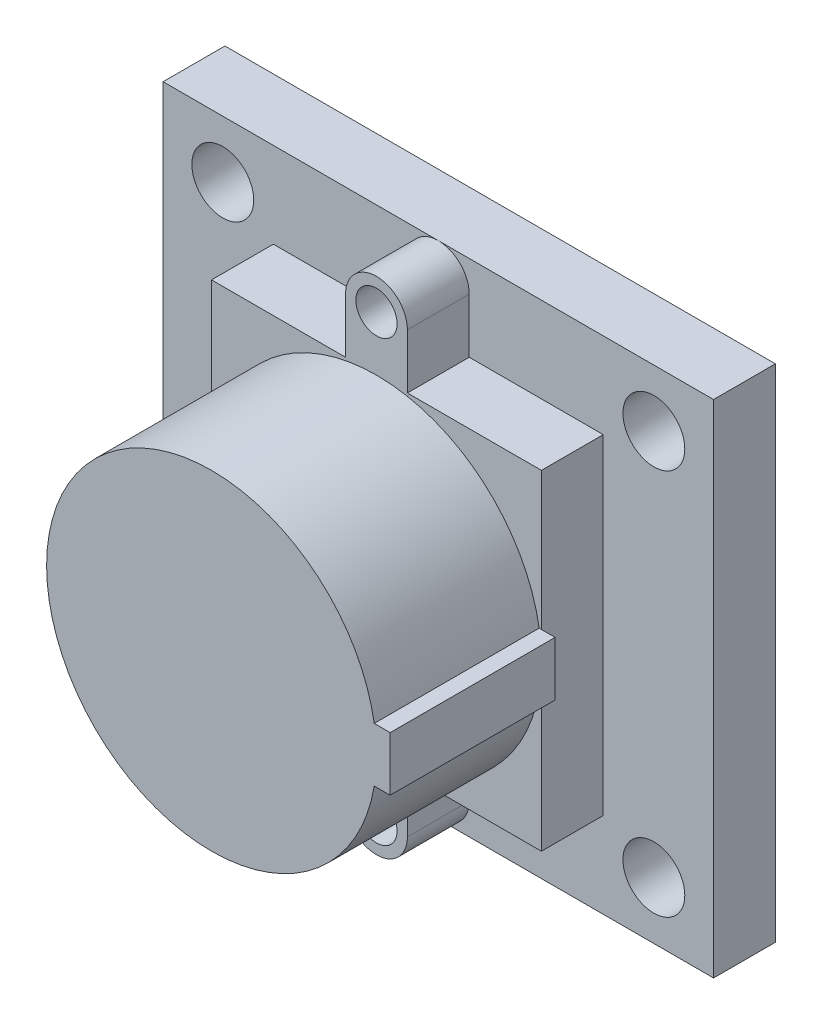
ISO-10303-21;
HEADER;
FILE_DESCRIPTION(('STEP AP214'),'2;1');
FILE_NAME('part.step','',(''),(''),'','','');
FILE_SCHEMA(('AUTOMOTIVE_DESIGN { 1 0 10303 214 1 1 1 1 }'));
ENDSEC;
DATA;
#1=APPLICATION_CONTEXT('core data for automotive mechanical design processes');
#2=APPLICATION_PROTOCOL_DEFINITION('international standard','automotive_design',2000,#1);
#3=PRODUCT_CONTEXT('',#1,'mechanical');
#4=PRODUCT('Part','Part','',(#3));
#5=PRODUCT_RELATED_PRODUCT_CATEGORY('part','',(#4));
#6=PRODUCT_DEFINITION_FORMATION('','',#4);
#7=PRODUCT_DEFINITION_CONTEXT('part definition',#1,'design');
#8=PRODUCT_DEFINITION('design','',#6,#7);
#9=PRODUCT_DEFINITION_SHAPE('','',#8);
#10=(LENGTH_UNIT() NAMED_UNIT(*) SI_UNIT(.MILLI.,.METRE.));
#11=(NAMED_UNIT(*) PLANE_ANGLE_UNIT() SI_UNIT($,.RADIAN.));
#12=(NAMED_UNIT(*) SI_UNIT($,.STERADIAN.) SOLID_ANGLE_UNIT());
#13=UNCERTAINTY_MEASURE_WITH_UNIT(LENGTH_MEASURE(1.E-05),#10,'distance_accuracy_value','');
#14=(GEOMETRIC_REPRESENTATION_CONTEXT(3) GLOBAL_UNCERTAINTY_ASSIGNED_CONTEXT((#13)) GLOBAL_UNIT_ASSIGNED_CONTEXT((#10,
#11,#12)) REPRESENTATION_CONTEXT('',''));
#15=CARTESIAN_POINT('',(0.,0.,0.));
#16=DIRECTION('',(0.,0.,1.));
#17=DIRECTION('',(1.,0.,0.));
#18=AXIS2_PLACEMENT_3D('',#15,#16,#17);
#19=CARTESIAN_POINT('',(20.0444022965701,10.65,6.));
#20=DIRECTION('',(0.,0.,1.));
#21=DIRECTION('',(1.,0.,0.));
#22=AXIS2_PLACEMENT_3D('',#19,#20,#21);
#23=PLANE('',#22);
#24=DIRECTION('',(1.,0.,0.));
#25=VECTOR('',#24,1.);
#26=CARTESIAN_POINT('',(27.9355322487527,-1.31532052282532,6.));
#27=LINE('',#26,#25);
#28=CARTESIAN_POINT('',(27.9355322487527,-1.31532052282532,6.));
#29=VERTEX_POINT('',#28);
#30=CARTESIAN_POINT('',(28.0444022965701,-1.31532052282533,6.));
#31=VERTEX_POINT('',#30);
#32=EDGE_CURVE('E59',#29,#31,#27,.T.);
#33=ORIENTED_EDGE('',*,*,#32,.F.);
#34=CARTESIAN_POINT('',(20.0444022965701,0.,6.));
#35=DIRECTION('',(0.,0.,1.));
#36=DIRECTION('',(1.,0.,0.));
#37=AXIS2_PLACEMENT_3D('',#34,#35,#36);
#38=CIRCLE('',#37,8.);
#39=CARTESIAN_POINT('',(12.0444022965701,0.,6.));
#40=VERTEX_POINT('',#39);
#41=EDGE_CURVE('E11',#40,#29,#38,.T.);
#42=ORIENTED_EDGE('',*,*,#41,.F.);
#43=DIRECTION('',(0.,-1.,0.));
#44=VECTOR('',#43,1.);
#45=CARTESIAN_POINT('',(12.0444022965701,8.,6.));
#46=LINE('',#45,#44);
#47=CARTESIAN_POINT('',(12.0444022965701,-8.,6.));
#48=VERTEX_POINT('',#47);
#49=EDGE_CURVE('E255',#40,#48,#46,.T.);
#50=ORIENTED_EDGE('',*,*,#49,.T.);
#51=DIRECTION('',(1.,0.,0.));
#52=VECTOR('',#51,1.);
#53=CARTESIAN_POINT('',(12.0444022965701,-8.,6.));
#54=LINE('',#53,#52);
#55=CARTESIAN_POINT('',(18.5444022965701,-8.,6.));
#56=VERTEX_POINT('',#55);
#57=EDGE_CURVE('E259',#48,#56,#54,.T.);
#58=ORIENTED_EDGE('',*,*,#57,.T.);
#59=DIRECTION('',(0.,-1.,0.));
#60=VECTOR('',#59,1.);
#61=CARTESIAN_POINT('',(18.5444022965701,-10.65,6.));
#62=LINE('',#61,#60);
#63=CARTESIAN_POINT('',(18.5444022965701,-10.65,6.));
#64=VERTEX_POINT('',#63);
#65=EDGE_CURVE('E261',#56,#64,#62,.T.);
#66=ORIENTED_EDGE('',*,*,#65,.T.);
#67=CARTESIAN_POINT('',(20.0444022965701,-10.65,6.));
#68=DIRECTION('',(0.,0.,1.));
#69=DIRECTION('',(1.,0.,0.));
#70=AXIS2_PLACEMENT_3D('',#67,#68,#69);
#71=CIRCLE('',#70,1.5);
#72=CARTESIAN_POINT('',(21.5444022965701,-10.65,6.));
#73=VERTEX_POINT('',#72);
#74=EDGE_CURVE('E263',#64,#73,#71,.T.);
#75=ORIENTED_EDGE('',*,*,#74,.T.);
#76=DIRECTION('',(0.,1.,0.));
#77=VECTOR('',#76,1.);
#78=CARTESIAN_POINT('',(21.5444022965701,-10.65,6.));
#79=LINE('',#78,#77);
#80=CARTESIAN_POINT('',(21.5444022965701,-8.,6.));
#81=VERTEX_POINT('',#80);
#82=EDGE_CURVE('E265',#73,#81,#79,.T.);
#83=ORIENTED_EDGE('',*,*,#82,.T.);
#84=DIRECTION('',(1.,0.,0.));
#85=VECTOR('',#84,1.);
#86=CARTESIAN_POINT('',(21.5444022965701,-8.,6.));
#87=LINE('',#86,#85);
#88=CARTESIAN_POINT('',(28.0444022965701,-8.,6.));
#89=VERTEX_POINT('',#88);
#90=EDGE_CURVE('E237',#81,#89,#87,.T.);
#91=ORIENTED_EDGE('',*,*,#90,.T.);
#92=DIRECTION('',(0.,1.,0.));
#93=VECTOR('',#92,1.);
#94=CARTESIAN_POINT('',(28.0444022965701,-1.75,6.));
#95=LINE('',#94,#93);
#96=EDGE_CURVE('E242',#89,#31,#95,.T.);
#97=ORIENTED_EDGE('',*,*,#96,.T.);
#98=EDGE_LOOP('',(#33,#42,#50,#58,#66,#75,#83,#91,#97));
#99=FACE_BOUND('',#98,.T.);
#100=CARTESIAN_POINT('',(20.0444022965701,-10.65,6.));
#101=DIRECTION('',(0.,0.,1.));
#102=DIRECTION('',(1.,0.,0.));
#103=AXIS2_PLACEMENT_3D('',#100,#101,#102);
#104=CIRCLE('',#103,1.);
#105=CARTESIAN_POINT('',(21.0444022965701,-10.65,6.));
#106=VERTEX_POINT('',#105);
#107=EDGE_CURVE('E222',#106,#106,#104,.T.);
#108=ORIENTED_EDGE('',*,*,#107,.F.);
#109=EDGE_LOOP('',(#108));
#110=FACE_BOUND('',#109,.T.);
#111=ADVANCED_FACE('F41',(#99,#110),#23,.T.);
#112=CARTESIAN_POINT('',(0.,0.,3.));
#113=DIRECTION('',(0.,0.,1.));
#114=DIRECTION('',(1.,0.,0.));
#115=AXIS2_PLACEMENT_3D('',#112,#113,#114);
#116=PLANE('',#115);
#117=CARTESIAN_POINT('',(20.0444022965701,-10.65,3.));
#118=DIRECTION('',(0.,0.,1.));
#119=DIRECTION('',(1.,0.,0.));
#120=AXIS2_PLACEMENT_3D('',#117,#118,#119);
#121=CIRCLE('',#120,1.5);
#122=CARTESIAN_POINT('',(20.0444022965701,-12.15,3.));
#123=VERTEX_POINT('',#122);
#124=CARTESIAN_POINT('',(21.5444022965701,-10.65,3.));
#125=VERTEX_POINT('',#124);
#126=EDGE_CURVE('E301',#123,#125,#121,.T.);
#127=ORIENTED_EDGE('',*,*,#126,.F.);
#128=DIRECTION('',(1.,0.,0.));
#129=VECTOR('',#128,1.);
#130=CARTESIAN_POINT('',(6.69440229657006,-12.15,3.));
#131=LINE('',#130,#129);
#132=CARTESIAN_POINT('',(33.3944022965701,-12.15,3.));
#133=VERTEX_POINT('',#132);
#134=EDGE_CURVE('E374',#123,#133,#131,.T.);
#135=ORIENTED_EDGE('',*,*,#134,.T.);
#136=DIRECTION('',(0.,1.,0.));
#137=VECTOR('',#136,1.);
#138=CARTESIAN_POINT('',(33.3944022965701,12.15,3.));
#139=LINE('',#138,#137);
#140=CARTESIAN_POINT('',(33.3944022965701,12.15,3.));
#141=VERTEX_POINT('',#140);
#142=EDGE_CURVE('E364',#133,#141,#139,.T.);
#143=ORIENTED_EDGE('',*,*,#142,.T.);
#144=DIRECTION('',(-1.,0.,0.));
#145=VECTOR('',#144,1.);
#146=CARTESIAN_POINT('',(6.69440229657006,12.15,3.));
#147=LINE('',#146,#145);
#148=CARTESIAN_POINT('',(20.0444022965701,12.15,3.));
#149=VERTEX_POINT('',#148);
#150=EDGE_CURVE('E369',#141,#149,#147,.T.);
#151=ORIENTED_EDGE('',*,*,#150,.T.);
#152=CARTESIAN_POINT('',(20.0444022965701,10.65,3.));
#153=DIRECTION('',(0.,0.,1.));
#154=DIRECTION('',(1.,0.,0.));
#155=AXIS2_PLACEMENT_3D('',#152,#153,#154);
#156=CIRCLE('',#155,1.5);
#157=CARTESIAN_POINT('',(21.5444022965701,10.65,3.));
#158=VERTEX_POINT('',#157);
#159=EDGE_CURVE('E279',#158,#149,#156,.T.);
#160=ORIENTED_EDGE('',*,*,#159,.F.);
#161=DIRECTION('',(0.,1.,0.));
#162=VECTOR('',#161,1.);
#163=CARTESIAN_POINT('',(21.5444022965701,10.65,3.));
#164=LINE('',#163,#162);
#165=CARTESIAN_POINT('',(21.5444022965701,8.,3.));
#166=VERTEX_POINT('',#165);
#167=EDGE_CURVE('E276',#166,#158,#164,.T.);
#168=ORIENTED_EDGE('',*,*,#167,.F.);
#169=DIRECTION('',(-1.,0.,0.));
#170=VECTOR('',#169,1.);
#171=CARTESIAN_POINT('',(21.5444022965701,8.,3.));
#172=LINE('',#171,#170);
#173=CARTESIAN_POINT('',(28.0444022965701,8.,3.));
#174=VERTEX_POINT('',#173);
#175=EDGE_CURVE('E273',#174,#166,#172,.T.);
#176=ORIENTED_EDGE('',*,*,#175,.F.);
#177=DIRECTION('',(0.,1.,0.));
#178=VECTOR('',#177,1.);
#179=CARTESIAN_POINT('',(28.0444022965701,8.,3.));
#180=LINE('',#179,#178);
#181=CARTESIAN_POINT('',(28.0444022965701,-8.,3.));
#182=VERTEX_POINT('',#181);
#183=EDGE_CURVE('E270',#182,#174,#180,.T.);
#184=ORIENTED_EDGE('',*,*,#183,.F.);
#185=DIRECTION('',(1.,0.,0.));
#186=VECTOR('',#185,1.);
#187=CARTESIAN_POINT('',(21.5444022965701,-8.,3.));
#188=LINE('',#187,#186);
#189=CARTESIAN_POINT('',(21.5444022965701,-8.,3.));
#190=VERTEX_POINT('',#189);
#191=EDGE_CURVE('E234',#190,#182,#188,.T.);
#192=ORIENTED_EDGE('',*,*,#191,.F.);
#193=DIRECTION('',(0.,1.,0.));
#194=VECTOR('',#193,1.);
#195=CARTESIAN_POINT('',(21.5444022965701,-10.65,3.));
#196=LINE('',#195,#194);
#197=EDGE_CURVE('E241',#125,#190,#196,.T.);
#198=ORIENTED_EDGE('',*,*,#197,.F.);
#199=EDGE_LOOP('',(#127,#135,#143,#151,#160,#168,#176,#184,#192,#198));
#200=FACE_BOUND('',#199,.T.);
#201=CARTESIAN_POINT('',(30.4994022965701,9.375,3.));
#202=DIRECTION('',(0.,0.,1.));
#203=DIRECTION('',(1.,0.,0.));
#204=AXIS2_PLACEMENT_3D('',#201,#202,#203);
#205=CIRCLE('',#204,1.5);
#206=CARTESIAN_POINT('',(31.9994022965701,9.375,3.));
#207=VERTEX_POINT('',#206);
#208=EDGE_CURVE('E358',#207,#207,#205,.T.);
#209=ORIENTED_EDGE('',*,*,#208,.F.);
#210=EDGE_LOOP('',(#209));
#211=FACE_BOUND('',#210,.T.);
#212=CARTESIAN_POINT('',(30.4994022965701,-9.375,3.));
#213=DIRECTION('',(0.,0.,1.));
#214=DIRECTION('',(1.,0.,0.));
#215=AXIS2_PLACEMENT_3D('',#212,#213,#214);
#216=CIRCLE('',#215,1.5);
#217=CARTESIAN_POINT('',(31.9994022965701,-9.375,3.));
#218=VERTEX_POINT('',#217);
#219=EDGE_CURVE('E346',#218,#218,#216,.T.);
#220=ORIENTED_EDGE('',*,*,#219,.F.);
#221=EDGE_LOOP('',(#220));
#222=FACE_BOUND('',#221,.T.);
#223=ADVANCED_FACE('F474',(#200,#211,#222),#116,.T.);
#224=CARTESIAN_POINT('',(18.5444022965701,-10.65,3.));
#225=VERTEX_POINT('',#224);
#226=EDGE_CURVE('E298',#225,#123,#121,.T.);
#227=ORIENTED_EDGE('',*,*,#226,.F.);
#228=DIRECTION('',(0.,-1.,0.));
#229=VECTOR('',#228,1.);
#230=CARTESIAN_POINT('',(18.5444022965701,-10.65,3.));
#231=LINE('',#230,#229);
#232=CARTESIAN_POINT('',(18.5444022965701,-8.,3.));
#233=VERTEX_POINT('',#232);
#234=EDGE_CURVE('E295',#233,#225,#231,.T.);
#235=ORIENTED_EDGE('',*,*,#234,.F.);
#236=DIRECTION('',(1.,0.,0.));
#237=VECTOR('',#236,1.);
#238=CARTESIAN_POINT('',(12.0444022965701,-8.,3.));
#239=LINE('',#238,#237);
#240=CARTESIAN_POINT('',(12.0444022965701,-8.,3.));
#241=VERTEX_POINT('',#240);
#242=EDGE_CURVE('E292',#241,#233,#239,.T.);
#243=ORIENTED_EDGE('',*,*,#242,.F.);
#244=DIRECTION('',(0.,-1.,0.));
#245=VECTOR('',#244,1.);
#246=CARTESIAN_POINT('',(12.0444022965701,-1.75,3.));
#247=LINE('',#246,#245);
#248=CARTESIAN_POINT('',(12.0444022965701,8.,3.));
#249=VERTEX_POINT('',#248);
#250=EDGE_CURVE('E289',#249,#241,#247,.T.);
#251=ORIENTED_EDGE('',*,*,#250,.F.);
#252=DIRECTION('',(-1.,0.,0.));
#253=VECTOR('',#252,1.);
#254=CARTESIAN_POINT('',(12.0444022965701,8.,3.));
#255=LINE('',#254,#253);
#256=CARTESIAN_POINT('',(18.5444022965701,8.,3.));
#257=VERTEX_POINT('',#256);
#258=EDGE_CURVE('E286',#257,#249,#255,.T.);
#259=ORIENTED_EDGE('',*,*,#258,.F.);
#260=DIRECTION('',(0.,-1.,0.));
#261=VECTOR('',#260,1.);
#262=CARTESIAN_POINT('',(18.5444022965701,10.65,3.));
#263=LINE('',#262,#261);
#264=CARTESIAN_POINT('',(18.5444022965701,10.65,3.));
#265=VERTEX_POINT('',#264);
#266=EDGE_CURVE('E282',#265,#257,#263,.T.);
#267=ORIENTED_EDGE('',*,*,#266,.F.);
#268=EDGE_CURVE('E283',#149,#265,#156,.T.);
#269=ORIENTED_EDGE('',*,*,#268,.F.);
#270=CARTESIAN_POINT('',(6.69440229657006,12.15,3.));
#271=VERTEX_POINT('',#270);
#272=EDGE_CURVE('E367',#149,#271,#147,.T.);
#273=ORIENTED_EDGE('',*,*,#272,.T.);
#274=DIRECTION('',(0.,-1.,0.));
#275=VECTOR('',#274,1.);
#276=CARTESIAN_POINT('',(6.69440229657006,12.15,3.));
#277=LINE('',#276,#275);
#278=CARTESIAN_POINT('',(6.69440229657006,-12.15,3.));
#279=VERTEX_POINT('',#278);
#280=EDGE_CURVE('E372',#271,#279,#277,.T.);
#281=ORIENTED_EDGE('',*,*,#280,.T.);
#282=EDGE_CURVE('E375',#279,#123,#131,.T.);
#283=ORIENTED_EDGE('',*,*,#282,.T.);
#284=EDGE_LOOP('',(#227,#235,#243,#251,#259,#267,#269,#273,#281,#283));
#285=FACE_BOUND('',#284,.T.);
#286=CARTESIAN_POINT('',(9.58940229657006,9.375,3.));
#287=DIRECTION('',(0.,0.,1.));
#288=DIRECTION('',(1.,0.,0.));
#289=AXIS2_PLACEMENT_3D('',#286,#287,#288);
#290=CIRCLE('',#289,1.5);
#291=CARTESIAN_POINT('',(11.0894022965701,9.375,3.));
#292=VERTEX_POINT('',#291);
#293=EDGE_CURVE('E352',#292,#292,#290,.T.);
#294=ORIENTED_EDGE('',*,*,#293,.F.);
#295=EDGE_LOOP('',(#294));
#296=FACE_BOUND('',#295,.T.);
#297=CARTESIAN_POINT('',(9.58940229657006,-9.375,3.));
#298=DIRECTION('',(0.,0.,1.));
#299=DIRECTION('',(1.,0.,0.));
#300=AXIS2_PLACEMENT_3D('',#297,#298,#299);
#301=CIRCLE('',#300,1.5);
#302=CARTESIAN_POINT('',(11.0894022965701,-9.375,3.));
#303=VERTEX_POINT('',#302);
#304=EDGE_CURVE('E340',#303,#303,#301,.T.);
#305=ORIENTED_EDGE('',*,*,#304,.F.);
#306=EDGE_LOOP('',(#305));
#307=FACE_BOUND('',#306,.T.);
#308=ADVANCED_FACE('F480',(#285,#296,#307),#116,.T.);
#309=CARTESIAN_POINT('',(0.,0.,0.));
#310=DIRECTION('',(0.,0.,1.));
#311=DIRECTION('',(1.,0.,0.));
#312=AXIS2_PLACEMENT_3D('',#309,#310,#311);
#313=PLANE('',#312);
#314=DIRECTION('',(0.,1.,0.));
#315=VECTOR('',#314,1.);
#316=CARTESIAN_POINT('',(33.3944022965701,12.15,0.));
#317=LINE('',#316,#315);
#318=CARTESIAN_POINT('',(33.3944022965701,-12.15,0.));
#319=VERTEX_POINT('',#318);
#320=CARTESIAN_POINT('',(33.3944022965701,12.15,0.));
#321=VERTEX_POINT('',#320);
#322=EDGE_CURVE('E361',#319,#321,#317,.T.);
#323=ORIENTED_EDGE('',*,*,#322,.F.);
#324=DIRECTION('',(1.,0.,0.));
#325=VECTOR('',#324,1.);
#326=CARTESIAN_POINT('',(6.69440229657006,-12.15,0.));
#327=LINE('',#326,#325);
#328=CARTESIAN_POINT('',(6.69440229657006,-12.15,0.));
#329=VERTEX_POINT('',#328);
#330=EDGE_CURVE('E368',#329,#319,#327,.T.);
#331=ORIENTED_EDGE('',*,*,#330,.F.);
#332=DIRECTION('',(0.,-1.,0.));
#333=VECTOR('',#332,1.);
#334=CARTESIAN_POINT('',(6.69440229657006,12.15,0.));
#335=LINE('',#334,#333);
#336=CARTESIAN_POINT('',(6.69440229657006,12.15,0.));
#337=VERTEX_POINT('',#336);
#338=EDGE_CURVE('E383',#337,#329,#335,.T.);
#339=ORIENTED_EDGE('',*,*,#338,.F.);
#340=DIRECTION('',(-1.,0.,0.));
#341=VECTOR('',#340,1.);
#342=CARTESIAN_POINT('',(6.69440229657006,12.15,0.));
#343=LINE('',#342,#341);
#344=EDGE_CURVE('E381',#321,#337,#343,.T.);
#345=ORIENTED_EDGE('',*,*,#344,.F.);
#346=EDGE_LOOP('',(#323,#331,#339,#345));
#347=FACE_BOUND('',#346,.T.);
#348=CARTESIAN_POINT('',(30.4994022965701,9.375,0.));
#349=DIRECTION('',(0.,0.,1.));
#350=DIRECTION('',(1.,0.,0.));
#351=AXIS2_PLACEMENT_3D('',#348,#349,#350);
#352=CIRCLE('',#351,1.5);
#353=CARTESIAN_POINT('',(31.9994022965701,9.375,0.));
#354=VERTEX_POINT('',#353);
#355=EDGE_CURVE('E355',#354,#354,#352,.T.);
#356=ORIENTED_EDGE('',*,*,#355,.T.);
#357=EDGE_LOOP('',(#356));
#358=FACE_BOUND('',#357,.T.);
#359=CARTESIAN_POINT('',(9.58940229657006,9.375,0.));
#360=DIRECTION('',(0.,0.,1.));
#361=DIRECTION('',(1.,0.,0.));
#362=AXIS2_PLACEMENT_3D('',#359,#360,#361);
#363=CIRCLE('',#362,1.5);
#364=CARTESIAN_POINT('',(11.0894022965701,9.375,0.));
#365=VERTEX_POINT('',#364);
#366=EDGE_CURVE('E349',#365,#365,#363,.T.);
#367=ORIENTED_EDGE('',*,*,#366,.T.);
#368=EDGE_LOOP('',(#367));
#369=FACE_BOUND('',#368,.T.);
#370=CARTESIAN_POINT('',(30.4994022965701,-9.375,0.));
#371=DIRECTION('',(0.,0.,1.));
#372=DIRECTION('',(1.,0.,0.));
#373=AXIS2_PLACEMENT_3D('',#370,#371,#372);
#374=CIRCLE('',#373,1.5);
#375=CARTESIAN_POINT('',(31.9994022965701,-9.375,0.));
#376=VERTEX_POINT('',#375);
#377=EDGE_CURVE('E343',#376,#376,#374,.T.);
#378=ORIENTED_EDGE('',*,*,#377,.T.);
#379=EDGE_LOOP('',(#378));
#380=FACE_BOUND('',#379,.T.);
#381=CARTESIAN_POINT('',(9.58940229657006,-9.375,0.));
#382=DIRECTION('',(0.,0.,1.));
#383=DIRECTION('',(1.,0.,0.));
#384=AXIS2_PLACEMENT_3D('',#381,#382,#383);
#385=CIRCLE('',#384,1.5);
#386=CARTESIAN_POINT('',(11.0894022965701,-9.375,0.));
#387=VERTEX_POINT('',#386);
#388=EDGE_CURVE('E339',#387,#387,#385,.T.);
#389=ORIENTED_EDGE('',*,*,#388,.T.);
#390=EDGE_LOOP('',(#389));
#391=FACE_BOUND('',#390,.T.);
#392=ADVANCED_FACE('F492',(#347,#358,#369,#380,#391),#313,.F.);
#393=CARTESIAN_POINT('',(33.3944022965701,12.15,3.));
#394=DIRECTION('',(-1.,0.,0.));
#395=DIRECTION('',(0.,0.,1.));
#396=AXIS2_PLACEMENT_3D('',#393,#394,#395);
#397=PLANE('',#396);
#398=ORIENTED_EDGE('',*,*,#322,.T.);
#399=DIRECTION('',(0.,0.,-1.));
#400=VECTOR('',#399,1.);
#401=CARTESIAN_POINT('',(33.3944022965701,12.15,3.));
#402=LINE('',#401,#400);
#403=EDGE_CURVE('E45',#141,#321,#402,.T.);
#404=ORIENTED_EDGE('',*,*,#403,.F.);
#405=ORIENTED_EDGE('',*,*,#142,.F.);
#406=DIRECTION('',(0.,0.,-1.));
#407=VECTOR('',#406,1.);
#408=CARTESIAN_POINT('',(33.3944022965701,-12.15,3.));
#409=LINE('',#408,#407);
#410=EDGE_CURVE('E378',#133,#319,#409,.T.);
#411=ORIENTED_EDGE('',*,*,#410,.T.);
#412=EDGE_LOOP('',(#398,#404,#405,#411));
#413=FACE_BOUND('',#412,.T.);
#414=ADVANCED_FACE('F43',(#413),#397,.F.);
#415=CARTESIAN_POINT('',(6.69440229657006,12.15,3.));
#416=DIRECTION('',(0.,-1.,0.));
#417=DIRECTION('',(1.,0.,0.));
#418=AXIS2_PLACEMENT_3D('',#415,#416,#417);
#419=PLANE('',#418);
#420=ORIENTED_EDGE('',*,*,#344,.T.);
#421=DIRECTION('',(0.,0.,-1.));
#422=VECTOR('',#421,1.);
#423=CARTESIAN_POINT('',(6.69440229657006,12.15,3.));
#424=LINE('',#423,#422);
#425=EDGE_CURVE('E390',#271,#337,#424,.T.);
#426=ORIENTED_EDGE('',*,*,#425,.F.);
#427=ORIENTED_EDGE('',*,*,#272,.F.);
#428=ORIENTED_EDGE('',*,*,#150,.F.);
#429=ORIENTED_EDGE('',*,*,#403,.T.);
#430=EDGE_LOOP('',(#420,#426,#427,#428,#429));
#431=FACE_BOUND('',#430,.T.);
#432=ADVANCED_FACE('F478',(#431),#419,.F.);
#433=CARTESIAN_POINT('',(6.69440229657006,12.15,3.));
#434=DIRECTION('',(1.,0.,0.));
#435=DIRECTION('',(0.,1.,0.));
#436=AXIS2_PLACEMENT_3D('',#433,#434,#435);
#437=PLANE('',#436);
#438=ORIENTED_EDGE('',*,*,#338,.T.);
#439=DIRECTION('',(0.,0.,-1.));
#440=VECTOR('',#439,1.);
#441=CARTESIAN_POINT('',(6.69440229657006,-12.15,3.));
#442=LINE('',#441,#440);
#443=EDGE_CURVE('E388',#279,#329,#442,.T.);
#444=ORIENTED_EDGE('',*,*,#443,.F.);
#445=ORIENTED_EDGE('',*,*,#280,.F.);
#446=ORIENTED_EDGE('',*,*,#425,.T.);
#447=EDGE_LOOP('',(#438,#444,#445,#446));
#448=FACE_BOUND('',#447,.T.);
#449=ADVANCED_FACE('F494',(#448),#437,.F.);
#450=CARTESIAN_POINT('',(6.69440229657006,-12.15,3.));
#451=DIRECTION('',(0.,1.,0.));
#452=DIRECTION('',(-1.,0.,0.));
#453=AXIS2_PLACEMENT_3D('',#450,#451,#452);
#454=PLANE('',#453);
#455=ORIENTED_EDGE('',*,*,#330,.T.);
#456=ORIENTED_EDGE('',*,*,#410,.F.);
#457=ORIENTED_EDGE('',*,*,#134,.F.);
#458=ORIENTED_EDGE('',*,*,#282,.F.);
#459=ORIENTED_EDGE('',*,*,#443,.T.);
#460=EDGE_LOOP('',(#455,#456,#457,#458,#459));
#461=FACE_BOUND('',#460,.T.);
#462=ADVANCED_FACE('F486',(#461),#454,.F.);
#463=CARTESIAN_POINT('',(30.4994022965701,9.375,3.));
#464=DIRECTION('',(0.,0.,-1.));
#465=DIRECTION('',(-1.,0.,0.));
#466=AXIS2_PLACEMENT_3D('',#463,#464,#465);
#467=CYLINDRICAL_SURFACE('',#466,1.5);
#468=ORIENTED_EDGE('',*,*,#208,.T.);
#469=EDGE_LOOP('',(#468));
#470=FACE_BOUND('',#469,.T.);
#471=ORIENTED_EDGE('',*,*,#355,.F.);
#472=EDGE_LOOP('',(#471));
#473=FACE_BOUND('',#472,.T.);
#474=ADVANCED_FACE('F502',(#470,#473),#467,.F.);
#475=CARTESIAN_POINT('',(9.58940229657006,9.375,3.));
#476=DIRECTION('',(0.,0.,-1.));
#477=DIRECTION('',(-1.,0.,0.));
#478=AXIS2_PLACEMENT_3D('',#475,#476,#477);
#479=CYLINDRICAL_SURFACE('',#478,1.5);
#480=ORIENTED_EDGE('',*,*,#293,.T.);
#481=EDGE_LOOP('',(#480));
#482=FACE_BOUND('',#481,.T.);
#483=ORIENTED_EDGE('',*,*,#366,.F.);
#484=EDGE_LOOP('',(#483));
#485=FACE_BOUND('',#484,.T.);
#486=ADVANCED_FACE('F529',(#482,#485),#479,.F.);
#487=CARTESIAN_POINT('',(30.4994022965701,-9.375,3.));
#488=DIRECTION('',(0.,0.,-1.));
#489=DIRECTION('',(-1.,0.,0.));
#490=AXIS2_PLACEMENT_3D('',#487,#488,#489);
#491=CYLINDRICAL_SURFACE('',#490,1.5);
#492=ORIENTED_EDGE('',*,*,#219,.T.);
#493=EDGE_LOOP('',(#492));
#494=FACE_BOUND('',#493,.T.);
#495=ORIENTED_EDGE('',*,*,#377,.F.);
#496=EDGE_LOOP('',(#495));
#497=FACE_BOUND('',#496,.T.);
#498=ADVANCED_FACE('F523',(#494,#497),#491,.F.);
#499=CARTESIAN_POINT('',(9.58940229657006,-9.375,3.));
#500=DIRECTION('',(0.,0.,-1.));
#501=DIRECTION('',(-1.,0.,0.));
#502=AXIS2_PLACEMENT_3D('',#499,#500,#501);
#503=CYLINDRICAL_SURFACE('',#502,1.5);
#504=ORIENTED_EDGE('',*,*,#304,.T.);
#505=EDGE_LOOP('',(#504));
#506=FACE_BOUND('',#505,.T.);
#507=ORIENTED_EDGE('',*,*,#388,.F.);
#508=EDGE_LOOP('',(#507));
#509=FACE_BOUND('',#508,.T.);
#510=ADVANCED_FACE('F516',(#506,#509),#503,.F.);
#511=CARTESIAN_POINT('',(27.9355322487527,1.31532052282533,6.));
#512=VERTEX_POINT('',#511);
#513=EDGE_CURVE('E52',#512,#40,#38,.T.);
#514=ORIENTED_EDGE('',*,*,#513,.F.);
#515=DIRECTION('',(-1.,0.,0.));
#516=VECTOR('',#515,1.);
#517=CARTESIAN_POINT('',(27.9355322487527,1.31532052282533,6.));
#518=LINE('',#517,#516);
#519=CARTESIAN_POINT('',(28.0444022965701,1.31532052282533,6.));
#520=VERTEX_POINT('',#519);
#521=EDGE_CURVE('E50',#520,#512,#518,.T.);
#522=ORIENTED_EDGE('',*,*,#521,.F.);
#523=CARTESIAN_POINT('',(28.0444022965701,8.,6.));
#524=VERTEX_POINT('',#523);
#525=EDGE_CURVE('E240',#520,#524,#95,.T.);
#526=ORIENTED_EDGE('',*,*,#525,.T.);
#527=DIRECTION('',(-1.,0.,0.));
#528=VECTOR('',#527,1.);
#529=CARTESIAN_POINT('',(21.5444022965701,8.,6.));
#530=LINE('',#529,#528);
#531=CARTESIAN_POINT('',(21.5444022965701,8.,6.));
#532=VERTEX_POINT('',#531);
#533=EDGE_CURVE('E244',#524,#532,#530,.T.);
#534=ORIENTED_EDGE('',*,*,#533,.T.);
#535=DIRECTION('',(0.,1.,0.));
#536=VECTOR('',#535,1.);
#537=CARTESIAN_POINT('',(21.5444022965701,10.65,6.));
#538=LINE('',#537,#536);
#539=CARTESIAN_POINT('',(21.5444022965701,10.65,6.));
#540=VERTEX_POINT('',#539);
#541=EDGE_CURVE('E247',#532,#540,#538,.T.);
#542=ORIENTED_EDGE('',*,*,#541,.T.);
#543=CARTESIAN_POINT('',(20.0444022965701,10.65,6.));
#544=DIRECTION('',(0.,0.,1.));
#545=DIRECTION('',(1.,0.,0.));
#546=AXIS2_PLACEMENT_3D('',#543,#544,#545);
#547=CIRCLE('',#546,1.5);
#548=CARTESIAN_POINT('',(18.5444022965701,10.65,6.));
#549=VERTEX_POINT('',#548);
#550=EDGE_CURVE('E249',#540,#549,#547,.T.);
#551=ORIENTED_EDGE('',*,*,#550,.T.);
#552=DIRECTION('',(0.,-1.,0.));
#553=VECTOR('',#552,1.);
#554=CARTESIAN_POINT('',(18.5444022965701,10.65,6.));
#555=LINE('',#554,#553);
#556=CARTESIAN_POINT('',(18.5444022965701,8.,6.));
#557=VERTEX_POINT('',#556);
#558=EDGE_CURVE('E251',#549,#557,#555,.T.);
#559=ORIENTED_EDGE('',*,*,#558,.T.);
#560=DIRECTION('',(-1.,0.,0.));
#561=VECTOR('',#560,1.);
#562=CARTESIAN_POINT('',(12.0444022965701,8.,6.));
#563=LINE('',#562,#561);
#564=CARTESIAN_POINT('',(12.0444022965701,8.,6.));
#565=VERTEX_POINT('',#564);
#566=EDGE_CURVE('E253',#557,#565,#563,.T.);
#567=ORIENTED_EDGE('',*,*,#566,.T.);
#568=EDGE_CURVE('E256',#565,#40,#46,.T.);
#569=ORIENTED_EDGE('',*,*,#568,.T.);
#570=EDGE_LOOP('',(#514,#522,#526,#534,#542,#551,#559,#567,#569));
#571=FACE_BOUND('',#570,.T.);
#572=CARTESIAN_POINT('',(20.0444022965701,10.65,6.));
#573=DIRECTION('',(0.,0.,1.));
#574=DIRECTION('',(1.,0.,0.));
#575=AXIS2_PLACEMENT_3D('',#572,#573,#574);
#576=CIRCLE('',#575,0.999999999999998);
#577=CARTESIAN_POINT('',(21.0444022965701,10.65,6.));
#578=VERTEX_POINT('',#577);
#579=EDGE_CURVE('E231',#578,#578,#576,.T.);
#580=ORIENTED_EDGE('',*,*,#579,.F.);
#581=EDGE_LOOP('',(#580));
#582=FACE_BOUND('',#581,.T.);
#583=ADVANCED_FACE('F429',(#571,#582),#23,.T.);
#584=CARTESIAN_POINT('',(21.5444022965701,-8.,6.));
#585=DIRECTION('',(0.,1.,0.));
#586=DIRECTION('',(0.,0.,1.));
#587=AXIS2_PLACEMENT_3D('',#584,#585,#586);
#588=PLANE('',#587);
#589=ORIENTED_EDGE('',*,*,#191,.T.);
#590=DIRECTION('',(0.,0.,-1.));
#591=VECTOR('',#590,1.);
#592=CARTESIAN_POINT('',(28.0444022965701,-8.,6.));
#593=LINE('',#592,#591);
#594=EDGE_CURVE('E336',#89,#182,#593,.T.);
#595=ORIENTED_EDGE('',*,*,#594,.F.);
#596=ORIENTED_EDGE('',*,*,#90,.F.);
#597=DIRECTION('',(0.,0.,-1.));
#598=VECTOR('',#597,1.);
#599=CARTESIAN_POINT('',(21.5444022965701,-8.,6.));
#600=LINE('',#599,#598);
#601=EDGE_CURVE('E267',#81,#190,#600,.T.);
#602=ORIENTED_EDGE('',*,*,#601,.T.);
#603=EDGE_LOOP('',(#589,#595,#596,#602));
#604=FACE_BOUND('',#603,.T.);
#605=ADVANCED_FACE('F472',(#604),#588,.F.);
#606=CARTESIAN_POINT('',(28.0444022965701,8.,6.));
#607=DIRECTION('',(-1.,0.,0.));
#608=DIRECTION('',(0.,0.,1.));
#609=AXIS2_PLACEMENT_3D('',#606,#607,#608);
#610=PLANE('',#609);
#611=ORIENTED_EDGE('',*,*,#183,.T.);
#612=DIRECTION('',(0.,0.,-1.));
#613=VECTOR('',#612,1.);
#614=CARTESIAN_POINT('',(28.0444022965701,8.,6.));
#615=LINE('',#614,#613);
#616=EDGE_CURVE('E333',#524,#174,#615,.T.);
#617=ORIENTED_EDGE('',*,*,#616,.F.);
#618=ORIENTED_EDGE('',*,*,#525,.F.);
#619=EDGE_CURVE('E245',#31,#520,#95,.T.);
#620=ORIENTED_EDGE('',*,*,#619,.F.);
#621=ORIENTED_EDGE('',*,*,#96,.F.);
#622=ORIENTED_EDGE('',*,*,#594,.T.);
#623=EDGE_LOOP('',(#611,#617,#618,#620,#621,#622));
#624=FACE_BOUND('',#623,.T.);
#625=ADVANCED_FACE('F433',(#624),#610,.F.);
#626=CARTESIAN_POINT('',(21.5444022965701,8.,6.));
#627=DIRECTION('',(0.,-1.,0.));
#628=DIRECTION('',(0.,0.,-1.));
#629=AXIS2_PLACEMENT_3D('',#626,#627,#628);
#630=PLANE('',#629);
#631=ORIENTED_EDGE('',*,*,#175,.T.);
#632=DIRECTION('',(0.,0.,-1.));
#633=VECTOR('',#632,1.);
#634=CARTESIAN_POINT('',(21.5444022965701,8.,6.));
#635=LINE('',#634,#633);
#636=EDGE_CURVE('E330',#532,#166,#635,.T.);
#637=ORIENTED_EDGE('',*,*,#636,.F.);
#638=ORIENTED_EDGE('',*,*,#533,.F.);
#639=ORIENTED_EDGE('',*,*,#616,.T.);
#640=EDGE_LOOP('',(#631,#637,#638,#639));
#641=FACE_BOUND('',#640,.T.);
#642=ADVANCED_FACE('F435',(#641),#630,.F.);
#643=CARTESIAN_POINT('',(21.5444022965701,10.65,6.));
#644=DIRECTION('',(-1.,0.,0.));
#645=DIRECTION('',(0.,-1.,0.));
#646=AXIS2_PLACEMENT_3D('',#643,#644,#645);
#647=PLANE('',#646);
#648=ORIENTED_EDGE('',*,*,#167,.T.);
#649=DIRECTION('',(0.,0.,-1.));
#650=VECTOR('',#649,1.);
#651=CARTESIAN_POINT('',(21.5444022965701,10.65,6.));
#652=LINE('',#651,#650);
#653=EDGE_CURVE('E327',#540,#158,#652,.T.);
#654=ORIENTED_EDGE('',*,*,#653,.F.);
#655=ORIENTED_EDGE('',*,*,#541,.F.);
#656=ORIENTED_EDGE('',*,*,#636,.T.);
#657=EDGE_LOOP('',(#648,#654,#655,#656));
#658=FACE_BOUND('',#657,.T.);
#659=ADVANCED_FACE('F439',(#658),#647,.F.);
#660=CARTESIAN_POINT('',(20.0444022965701,10.65,6.));
#661=DIRECTION('',(0.,0.,-1.));
#662=DIRECTION('',(-1.,0.,0.));
#663=AXIS2_PLACEMENT_3D('',#660,#661,#662);
#664=CYLINDRICAL_SURFACE('',#663,1.5);
#665=ORIENTED_EDGE('',*,*,#159,.T.);
#666=ORIENTED_EDGE('',*,*,#268,.T.);
#667=DIRECTION('',(0.,0.,-1.));
#668=VECTOR('',#667,1.);
#669=CARTESIAN_POINT('',(18.5444022965701,10.65,6.));
#670=LINE('',#669,#668);
#671=EDGE_CURVE('E324',#549,#265,#670,.T.);
#672=ORIENTED_EDGE('',*,*,#671,.F.);
#673=ORIENTED_EDGE('',*,*,#550,.F.);
#674=ORIENTED_EDGE('',*,*,#653,.T.);
#675=EDGE_LOOP('',(#665,#666,#672,#673,#674));
#676=FACE_BOUND('',#675,.T.);
#677=ADVANCED_FACE('F443',(#676),#664,.T.);
#678=CARTESIAN_POINT('',(18.5444022965701,10.65,6.));
#679=DIRECTION('',(1.,0.,0.));
#680=DIRECTION('',(0.,1.,0.));
#681=AXIS2_PLACEMENT_3D('',#678,#679,#680);
#682=PLANE('',#681);
#683=ORIENTED_EDGE('',*,*,#266,.T.);
#684=DIRECTION('',(0.,0.,-1.));
#685=VECTOR('',#684,1.);
#686=CARTESIAN_POINT('',(18.5444022965701,8.,6.));
#687=LINE('',#686,#685);
#688=EDGE_CURVE('E321',#557,#257,#687,.T.);
#689=ORIENTED_EDGE('',*,*,#688,.F.);
#690=ORIENTED_EDGE('',*,*,#558,.F.);
#691=ORIENTED_EDGE('',*,*,#671,.T.);
#692=EDGE_LOOP('',(#683,#689,#690,#691));
#693=FACE_BOUND('',#692,.T.);
#694=ADVANCED_FACE('F445',(#693),#682,.F.);
#695=CARTESIAN_POINT('',(12.0444022965701,8.,6.));
#696=DIRECTION('',(0.,-1.,0.));
#697=DIRECTION('',(0.,0.,-1.));
#698=AXIS2_PLACEMENT_3D('',#695,#696,#697);
#699=PLANE('',#698);
#700=ORIENTED_EDGE('',*,*,#258,.T.);
#701=DIRECTION('',(0.,0.,-1.));
#702=VECTOR('',#701,1.);
#703=CARTESIAN_POINT('',(12.0444022965701,8.,6.));
#704=LINE('',#703,#702);
#705=EDGE_CURVE('E318',#565,#249,#704,.T.);
#706=ORIENTED_EDGE('',*,*,#705,.F.);
#707=ORIENTED_EDGE('',*,*,#566,.F.);
#708=ORIENTED_EDGE('',*,*,#688,.T.);
#709=EDGE_LOOP('',(#700,#706,#707,#708));
#710=FACE_BOUND('',#709,.T.);
#711=ADVANCED_FACE('F449',(#710),#699,.F.);
#712=CARTESIAN_POINT('',(12.0444022965701,-1.75,6.));
#713=DIRECTION('',(1.,0.,0.));
#714=DIRECTION('',(0.,0.,-1.));
#715=AXIS2_PLACEMENT_3D('',#712,#713,#714);
#716=PLANE('',#715);
#717=ORIENTED_EDGE('',*,*,#250,.T.);
#718=DIRECTION('',(0.,0.,-1.));
#719=VECTOR('',#718,1.);
#720=CARTESIAN_POINT('',(12.0444022965701,-8.,6.));
#721=LINE('',#720,#719);
#722=EDGE_CURVE('E315',#48,#241,#721,.T.);
#723=ORIENTED_EDGE('',*,*,#722,.F.);
#724=ORIENTED_EDGE('',*,*,#49,.F.);
#725=ORIENTED_EDGE('',*,*,#568,.F.);
#726=ORIENTED_EDGE('',*,*,#705,.T.);
#727=EDGE_LOOP('',(#717,#723,#724,#725,#726));
#728=FACE_BOUND('',#727,.T.);
#729=ADVANCED_FACE('F452',(#728),#716,.F.);
#730=CARTESIAN_POINT('',(12.0444022965701,-8.,6.));
#731=DIRECTION('',(0.,1.,0.));
#732=DIRECTION('',(0.,0.,1.));
#733=AXIS2_PLACEMENT_3D('',#730,#731,#732);
#734=PLANE('',#733);
#735=ORIENTED_EDGE('',*,*,#242,.T.);
#736=DIRECTION('',(0.,0.,-1.));
#737=VECTOR('',#736,1.);
#738=CARTESIAN_POINT('',(18.5444022965701,-8.,6.));
#739=LINE('',#738,#737);
#740=EDGE_CURVE('E312',#56,#233,#739,.T.);
#741=ORIENTED_EDGE('',*,*,#740,.F.);
#742=ORIENTED_EDGE('',*,*,#57,.F.);
#743=ORIENTED_EDGE('',*,*,#722,.T.);
#744=EDGE_LOOP('',(#735,#741,#742,#743));
#745=FACE_BOUND('',#744,.T.);
#746=ADVANCED_FACE('F460',(#745),#734,.F.);
#747=CARTESIAN_POINT('',(18.5444022965701,-10.65,6.));
#748=DIRECTION('',(1.,0.,0.));
#749=DIRECTION('',(0.,0.,-1.));
#750=AXIS2_PLACEMENT_3D('',#747,#748,#749);
#751=PLANE('',#750);
#752=ORIENTED_EDGE('',*,*,#234,.T.);
#753=DIRECTION('',(0.,0.,-1.));
#754=VECTOR('',#753,1.);
#755=CARTESIAN_POINT('',(18.5444022965701,-10.65,6.));
#756=LINE('',#755,#754);
#757=EDGE_CURVE('E309',#64,#225,#756,.T.);
#758=ORIENTED_EDGE('',*,*,#757,.F.);
#759=ORIENTED_EDGE('',*,*,#65,.F.);
#760=ORIENTED_EDGE('',*,*,#740,.T.);
#761=EDGE_LOOP('',(#752,#758,#759,#760));
#762=FACE_BOUND('',#761,.T.);
#763=ADVANCED_FACE('F462',(#762),#751,.F.);
#764=CARTESIAN_POINT('',(20.0444022965701,-10.65,6.));
#765=DIRECTION('',(0.,0.,-1.));
#766=DIRECTION('',(-1.,0.,0.));
#767=AXIS2_PLACEMENT_3D('',#764,#765,#766);
#768=CYLINDRICAL_SURFACE('',#767,1.5);
#769=ORIENTED_EDGE('',*,*,#226,.T.);
#770=ORIENTED_EDGE('',*,*,#126,.T.);
#771=DIRECTION('',(0.,0.,-1.));
#772=VECTOR('',#771,1.);
#773=CARTESIAN_POINT('',(21.5444022965701,-10.65,6.));
#774=LINE('',#773,#772);
#775=EDGE_CURVE('E306',#73,#125,#774,.T.);
#776=ORIENTED_EDGE('',*,*,#775,.F.);
#777=ORIENTED_EDGE('',*,*,#74,.F.);
#778=ORIENTED_EDGE('',*,*,#757,.T.);
#779=EDGE_LOOP('',(#769,#770,#776,#777,#778));
#780=FACE_BOUND('',#779,.T.);
#781=ADVANCED_FACE('F464',(#780),#768,.T.);
#782=CARTESIAN_POINT('',(21.5444022965701,-10.65,6.));
#783=DIRECTION('',(-1.,0.,0.));
#784=DIRECTION('',(0.,0.,1.));
#785=AXIS2_PLACEMENT_3D('',#782,#783,#784);
#786=PLANE('',#785);
#787=ORIENTED_EDGE('',*,*,#197,.T.);
#788=ORIENTED_EDGE('',*,*,#601,.F.);
#789=ORIENTED_EDGE('',*,*,#82,.F.);
#790=ORIENTED_EDGE('',*,*,#775,.T.);
#791=EDGE_LOOP('',(#787,#788,#789,#790));
#792=FACE_BOUND('',#791,.T.);
#793=ADVANCED_FACE('F470',(#792),#786,.F.);
#794=CARTESIAN_POINT('',(20.0444022965701,10.65,6.));
#795=DIRECTION('',(0.,0.,-1.));
#796=DIRECTION('',(-1.,0.,0.));
#797=AXIS2_PLACEMENT_3D('',#794,#795,#796);
#798=CYLINDRICAL_SURFACE('',#797,0.999999999999998);
#799=ORIENTED_EDGE('',*,*,#579,.T.);
#800=EDGE_LOOP('',(#799));
#801=FACE_BOUND('',#800,.T.);
#802=CARTESIAN_POINT('',(20.0444022965701,10.65,3.));
#803=DIRECTION('',(0.,0.,1.));
#804=DIRECTION('',(1.,0.,0.));
#805=AXIS2_PLACEMENT_3D('',#802,#803,#804);
#806=CIRCLE('',#805,0.999999999999998);
#807=CARTESIAN_POINT('',(21.0444022965701,10.65,3.));
#808=VERTEX_POINT('',#807);
#809=EDGE_CURVE('E229',#808,#808,#806,.T.);
#810=ORIENTED_EDGE('',*,*,#809,.F.);
#811=EDGE_LOOP('',(#810));
#812=FACE_BOUND('',#811,.T.);
#813=ADVANCED_FACE('F719',(#801,#812),#798,.F.);
#814=CARTESIAN_POINT('',(20.0444022965701,-10.65,6.));
#815=DIRECTION('',(0.,0.,-1.));
#816=DIRECTION('',(-1.,0.,0.));
#817=AXIS2_PLACEMENT_3D('',#814,#815,#816);
#818=CYLINDRICAL_SURFACE('',#817,1.);
#819=ORIENTED_EDGE('',*,*,#107,.T.);
#820=EDGE_LOOP('',(#819));
#821=FACE_BOUND('',#820,.T.);
#822=CARTESIAN_POINT('',(20.0444022965701,-10.65,3.));
#823=DIRECTION('',(0.,0.,1.));
#824=DIRECTION('',(1.,0.,0.));
#825=AXIS2_PLACEMENT_3D('',#822,#823,#824);
#826=CIRCLE('',#825,1.);
#827=CARTESIAN_POINT('',(21.0444022965701,-10.65,3.));
#828=VERTEX_POINT('',#827);
#829=EDGE_CURVE('E219',#828,#828,#826,.T.);
#830=ORIENTED_EDGE('',*,*,#829,.F.);
#831=EDGE_LOOP('',(#830));
#832=FACE_BOUND('',#831,.T.);
#833=ADVANCED_FACE('F605',(#821,#832),#818,.F.);
#834=ORIENTED_EDGE('',*,*,#809,.T.);
#835=EDGE_LOOP('',(#834));
#836=FACE_BOUND('',#835,.T.);
#837=ADVANCED_FACE('F513',(#836),#116,.T.);
#838=ORIENTED_EDGE('',*,*,#829,.T.);
#839=EDGE_LOOP('',(#838));
#840=FACE_BOUND('',#839,.T.);
#841=ADVANCED_FACE('F541',(#840),#116,.T.);
#842=CARTESIAN_POINT('',(20.0444022965701,0.,6.));
#843=DIRECTION('',(0.,0.,1.));
#844=DIRECTION('',(1.,0.,0.));
#845=AXIS2_PLACEMENT_3D('',#842,#843,#844);
#846=PLANE('',#845);
#847=CARTESIAN_POINT('',(28.7090627692312,-1.31532052282533,6.));
#848=VERTEX_POINT('',#847);
#849=EDGE_CURVE('E409',#31,#848,#27,.T.);
#850=ORIENTED_EDGE('',*,*,#849,.F.);
#851=ORIENTED_EDGE('',*,*,#619,.T.);
#852=CARTESIAN_POINT('',(28.7090627692312,1.31532052282533,6.));
#853=VERTEX_POINT('',#852);
#854=EDGE_CURVE('E406',#853,#520,#518,.T.);
#855=ORIENTED_EDGE('',*,*,#854,.F.);
#856=DIRECTION('',(0.,1.,0.));
#857=VECTOR('',#856,1.);
#858=CARTESIAN_POINT('',(28.7090627692312,1.31532052282533,6.));
#859=LINE('',#858,#857);
#860=EDGE_CURVE('E218',#848,#853,#859,.T.);
#861=ORIENTED_EDGE('',*,*,#860,.F.);
#862=EDGE_LOOP('',(#850,#851,#855,#861));
#863=FACE_BOUND('',#862,.T.);
#864=ADVANCED_FACE('F423',(#863),#846,.F.);
#865=CARTESIAN_POINT('',(28.7090627692312,1.31532052282533,14.));
#866=DIRECTION('',(-1.,0.,0.));
#867=DIRECTION('',(0.,0.,1.));
#868=AXIS2_PLACEMENT_3D('',#865,#866,#867);
#869=PLANE('',#868);
#870=ORIENTED_EDGE('',*,*,#860,.T.);
#871=DIRECTION('',(0.,0.,-1.));
#872=VECTOR('',#871,1.);
#873=CARTESIAN_POINT('',(28.7090627692312,1.31532052282533,14.));
#874=LINE('',#873,#872);
#875=CARTESIAN_POINT('',(28.7090627692312,1.31532052282533,14.));
#876=VERTEX_POINT('',#875);
#877=EDGE_CURVE('E198',#876,#853,#874,.T.);
#878=ORIENTED_EDGE('',*,*,#877,.F.);
#879=DIRECTION('',(0.,1.,0.));
#880=VECTOR('',#879,1.);
#881=CARTESIAN_POINT('',(28.7090627692312,1.31532052282533,14.));
#882=LINE('',#881,#880);
#883=CARTESIAN_POINT('',(28.7090627692312,-1.31532052282533,14.));
#884=VERTEX_POINT('',#883);
#885=EDGE_CURVE('E206',#884,#876,#882,.T.);
#886=ORIENTED_EDGE('',*,*,#885,.F.);
#887=DIRECTION('',(0.,0.,-1.));
#888=VECTOR('',#887,1.);
#889=CARTESIAN_POINT('',(28.7090627692312,-1.31532052282533,14.));
#890=LINE('',#889,#888);
#891=EDGE_CURVE('E412',#884,#848,#890,.T.);
#892=ORIENTED_EDGE('',*,*,#891,.T.);
#893=EDGE_LOOP('',(#870,#878,#886,#892));
#894=FACE_BOUND('',#893,.T.);
#895=ADVANCED_FACE('F216',(#894),#869,.F.);
#896=CARTESIAN_POINT('',(27.9355322487527,1.31532052282533,14.));
#897=DIRECTION('',(0.,-1.,0.));
#898=DIRECTION('',(0.,0.,-1.));
#899=AXIS2_PLACEMENT_3D('',#896,#897,#898);
#900=PLANE('',#899);
#901=ORIENTED_EDGE('',*,*,#854,.T.);
#902=ORIENTED_EDGE('',*,*,#521,.T.);
#903=DIRECTION('',(0.,0.,-1.));
#904=VECTOR('',#903,1.);
#905=CARTESIAN_POINT('',(27.9355322487527,1.31532052282533,14.));
#906=LINE('',#905,#904);
#907=CARTESIAN_POINT('',(27.9355322487527,1.31532052282533,14.));
#908=VERTEX_POINT('',#907);
#909=EDGE_CURVE('E202',#908,#512,#906,.T.);
#910=ORIENTED_EDGE('',*,*,#909,.F.);
#911=DIRECTION('',(-1.,0.,0.));
#912=VECTOR('',#911,1.);
#913=CARTESIAN_POINT('',(27.9355322487527,1.31532052282533,14.));
#914=LINE('',#913,#912);
#915=EDGE_CURVE('E193',#876,#908,#914,.T.);
#916=ORIENTED_EDGE('',*,*,#915,.F.);
#917=ORIENTED_EDGE('',*,*,#877,.T.);
#918=EDGE_LOOP('',(#901,#902,#910,#916,#917));
#919=FACE_BOUND('',#918,.T.);
#920=ADVANCED_FACE('F196',(#919),#900,.F.);
#921=CARTESIAN_POINT('',(20.0444022965701,0.,14.));
#922=DIRECTION('',(0.,0.,-1.));
#923=DIRECTION('',(-1.,0.,0.));
#924=AXIS2_PLACEMENT_3D('',#921,#922,#923);
#925=CYLINDRICAL_SURFACE('',#924,8.);
#926=ORIENTED_EDGE('',*,*,#513,.T.);
#927=ORIENTED_EDGE('',*,*,#41,.T.);
#928=DIRECTION('',(0.,0.,-1.));
#929=VECTOR('',#928,1.);
#930=CARTESIAN_POINT('',(27.9355322487527,-1.31532052282532,14.));
#931=LINE('',#930,#929);
#932=CARTESIAN_POINT('',(27.9355322487527,-1.31532052282532,14.));
#933=VERTEX_POINT('',#932);
#934=EDGE_CURVE('E224',#933,#29,#931,.T.);
#935=ORIENTED_EDGE('',*,*,#934,.F.);
#936=CARTESIAN_POINT('',(20.0444022965701,0.,14.));
#937=DIRECTION('',(0.,0.,1.));
#938=DIRECTION('',(1.,0.,0.));
#939=AXIS2_PLACEMENT_3D('',#936,#937,#938);
#940=CIRCLE('',#939,8.);
#941=EDGE_CURVE('E205',#908,#933,#940,.T.);
#942=ORIENTED_EDGE('',*,*,#941,.F.);
#943=ORIENTED_EDGE('',*,*,#909,.T.);
#944=EDGE_LOOP('',(#926,#927,#935,#942,#943));
#945=FACE_BOUND('',#944,.T.);
#946=ADVANCED_FACE('F416',(#945),#925,.T.);
#947=CARTESIAN_POINT('',(27.9355322487527,-1.31532052282532,14.));
#948=DIRECTION('',(0.,1.,0.));
#949=DIRECTION('',(-1.,0.,0.));
#950=AXIS2_PLACEMENT_3D('',#947,#948,#949);
#951=PLANE('',#950);
#952=ORIENTED_EDGE('',*,*,#32,.T.);
#953=ORIENTED_EDGE('',*,*,#849,.T.);
#954=ORIENTED_EDGE('',*,*,#891,.F.);
#955=DIRECTION('',(1.,0.,0.));
#956=VECTOR('',#955,1.);
#957=CARTESIAN_POINT('',(27.9355322487527,-1.31532052282532,14.));
#958=LINE('',#957,#956);
#959=EDGE_CURVE('E211',#933,#884,#958,.T.);
#960=ORIENTED_EDGE('',*,*,#959,.F.);
#961=ORIENTED_EDGE('',*,*,#934,.T.);
#962=EDGE_LOOP('',(#952,#953,#954,#960,#961));
#963=FACE_BOUND('',#962,.T.);
#964=ADVANCED_FACE('F418',(#963),#951,.F.);
#965=CARTESIAN_POINT('',(20.0444022965701,0.,14.));
#966=DIRECTION('',(0.,0.,1.));
#967=DIRECTION('',(1.,0.,0.));
#968=AXIS2_PLACEMENT_3D('',#965,#966,#967);
#969=PLANE('',#968);
#970=ORIENTED_EDGE('',*,*,#885,.T.);
#971=ORIENTED_EDGE('',*,*,#915,.T.);
#972=ORIENTED_EDGE('',*,*,#941,.T.);
#973=ORIENTED_EDGE('',*,*,#959,.T.);
#974=EDGE_LOOP('',(#970,#971,#972,#973));
#975=FACE_BOUND('',#974,.T.);
#976=ADVANCED_FACE('F209',(#975),#969,.T.);
#977=CLOSED_SHELL('',(#111,#223,#308,#392,#414,#432,#449,#462,#474,#486,#498,#510,#583,#605,
#625,#642,#659,#677,#694,#711,#729,#746,#763,#781,#793,#813,#833,#837,#841,#864,#895,#920,#946,
#964,#976));
#978=MANIFOLD_SOLID_BREP('B2',#977);
#979=ADVANCED_BREP_SHAPE_REPRESENTATION('',(#18,#978),#14);
#980=SHAPE_DEFINITION_REPRESENTATION(#9,#979);
ENDSEC;
END-ISO-10303-21;
